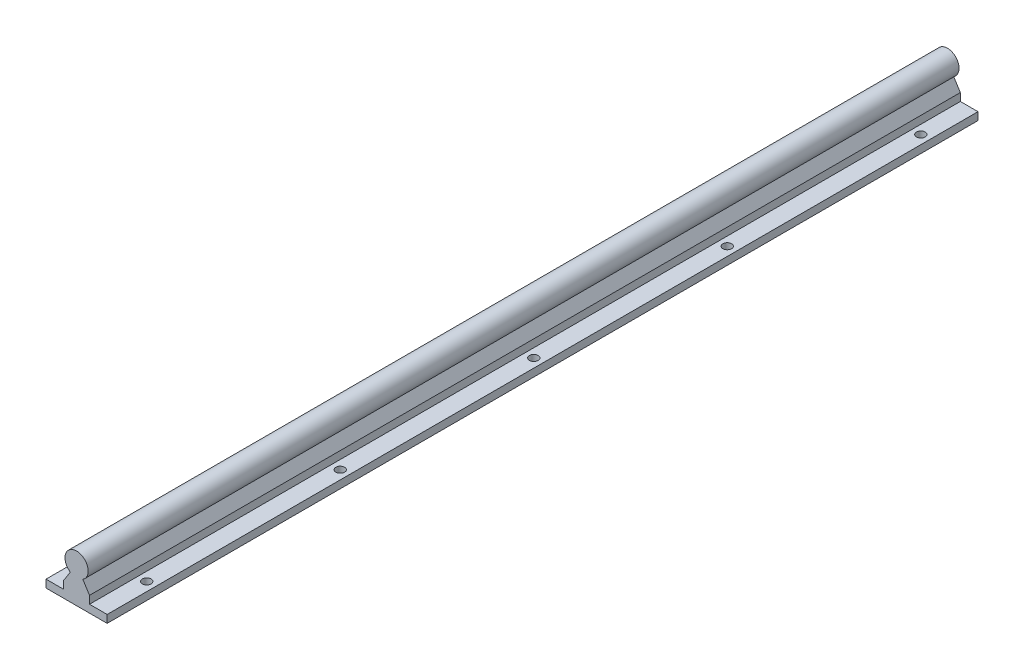
ISO-10303-21;
HEADER;
FILE_DESCRIPTION(('STEP AP214'),'2;1');
FILE_NAME('part.step','',(''),(''),'','','');
FILE_SCHEMA(('AUTOMOTIVE_DESIGN { 1 0 10303 214 1 1 1 1 }'));
ENDSEC;
DATA;
#1=APPLICATION_CONTEXT('core data for automotive mechanical design processes');
#2=APPLICATION_PROTOCOL_DEFINITION('international standard','automotive_design',2000,#1);
#3=PRODUCT_CONTEXT('',#1,'mechanical');
#4=PRODUCT('Part','Part','',(#3));
#5=PRODUCT_RELATED_PRODUCT_CATEGORY('part','',(#4));
#6=PRODUCT_DEFINITION_FORMATION('','',#4);
#7=PRODUCT_DEFINITION_CONTEXT('part definition',#1,'design');
#8=PRODUCT_DEFINITION('design','',#6,#7);
#9=PRODUCT_DEFINITION_SHAPE('','',#8);
#10=(LENGTH_UNIT() NAMED_UNIT(*) SI_UNIT(.MILLI.,.METRE.));
#11=(NAMED_UNIT(*) PLANE_ANGLE_UNIT() SI_UNIT($,.RADIAN.));
#12=(NAMED_UNIT(*) SI_UNIT($,.STERADIAN.) SOLID_ANGLE_UNIT());
#13=UNCERTAINTY_MEASURE_WITH_UNIT(LENGTH_MEASURE(1.E-05),#10,'distance_accuracy_value','');
#14=(GEOMETRIC_REPRESENTATION_CONTEXT(3) GLOBAL_UNCERTAINTY_ASSIGNED_CONTEXT((#13)) GLOBAL_UNIT_ASSIGNED_CONTEXT((#10,
#11,#12)) REPRESENTATION_CONTEXT('',''));
#15=CARTESIAN_POINT('',(0.,0.,0.));
#16=DIRECTION('',(0.,0.,1.));
#17=DIRECTION('',(1.,0.,0.));
#18=AXIS2_PLACEMENT_3D('',#15,#16,#17);
#19=CARTESIAN_POINT('',(-15.8,0.,450.));
#20=DIRECTION('',(1.,0.,0.));
#21=DIRECTION('',(0.,0.,-1.));
#22=AXIS2_PLACEMENT_3D('',#19,#20,#21);
#23=PLANE('',#22);
#24=DIRECTION('',(0.,-1.,0.));
#25=VECTOR('',#24,1.);
#26=CARTESIAN_POINT('',(-15.8,0.,0.));
#27=LINE('',#26,#25);
#28=CARTESIAN_POINT('',(-15.8,4.,0.));
#29=VERTEX_POINT('',#28);
#30=CARTESIAN_POINT('',(-15.8,0.,0.));
#31=VERTEX_POINT('',#30);
#32=EDGE_CURVE('E143',#29,#31,#27,.T.);
#33=ORIENTED_EDGE('',*,*,#32,.T.);
#34=DIRECTION('',(0.,0.,-1.));
#35=VECTOR('',#34,1.);
#36=CARTESIAN_POINT('',(-15.8,0.,450.));
#37=LINE('',#36,#35);
#38=CARTESIAN_POINT('',(-15.8,0.,450.));
#39=VERTEX_POINT('',#38);
#40=EDGE_CURVE('E11',#39,#31,#37,.T.);
#41=ORIENTED_EDGE('',*,*,#40,.F.);
#42=DIRECTION('',(0.,-1.,0.));
#43=VECTOR('',#42,1.);
#44=CARTESIAN_POINT('',(-15.8,0.,450.));
#45=LINE('',#44,#43);
#46=CARTESIAN_POINT('',(-15.8,4.,450.));
#47=VERTEX_POINT('',#46);
#48=EDGE_CURVE('E162',#47,#39,#45,.T.);
#49=ORIENTED_EDGE('',*,*,#48,.F.);
#50=DIRECTION('',(0.,0.,-1.));
#51=VECTOR('',#50,1.);
#52=CARTESIAN_POINT('',(-15.8,4.,450.));
#53=LINE('',#52,#51);
#54=EDGE_CURVE('E139',#47,#29,#53,.T.);
#55=ORIENTED_EDGE('',*,*,#54,.T.);
#56=EDGE_LOOP('',(#33,#41,#49,#55));
#57=FACE_BOUND('',#56,.T.);
#58=ADVANCED_FACE('F33',(#57),#23,.F.);
#59=CARTESIAN_POINT('',(-15.8,0.,450.));
#60=DIRECTION('',(0.,1.,0.));
#61=DIRECTION('',(-1.,0.,0.));
#62=AXIS2_PLACEMENT_3D('',#59,#60,#61);
#63=PLANE('',#62);
#64=CARTESIAN_POINT('',(11.2446188692435,0.,425.));
#65=DIRECTION('',(0.,1.,0.));
#66=DIRECTION('',(0.,0.,-1.));
#67=AXIS2_PLACEMENT_3D('',#64,#65,#66);
#68=CIRCLE('',#67,2.25);
#69=CARTESIAN_POINT('',(11.2446188692435,0.,422.75));
#70=VERTEX_POINT('',#69);
#71=EDGE_CURVE('E222',#70,#70,#68,.T.);
#72=ORIENTED_EDGE('',*,*,#71,.T.);
#73=EDGE_LOOP('',(#72));
#74=FACE_BOUND('',#73,.T.);
#75=CARTESIAN_POINT('',(-11.2446188692351,0.,425.));
#76=DIRECTION('',(0.,1.,0.));
#77=DIRECTION('',(0.,0.,1.));
#78=AXIS2_PLACEMENT_3D('',#75,#76,#77);
#79=CIRCLE('',#78,2.25);
#80=CARTESIAN_POINT('',(-11.2446188692351,0.,427.25));
#81=VERTEX_POINT('',#80);
#82=EDGE_CURVE('E212',#81,#81,#79,.T.);
#83=ORIENTED_EDGE('',*,*,#82,.T.);
#84=EDGE_LOOP('',(#83));
#85=FACE_BOUND('',#84,.T.);
#86=CARTESIAN_POINT('',(11.2446188692424,0.,325.));
#87=DIRECTION('',(0.,1.,0.));
#88=DIRECTION('',(0.,0.,-1.));
#89=AXIS2_PLACEMENT_3D('',#86,#87,#88);
#90=CIRCLE('',#89,2.25);
#91=CARTESIAN_POINT('',(11.2446188692424,0.,322.75));
#92=VERTEX_POINT('',#91);
#93=EDGE_CURVE('E209',#92,#92,#90,.T.);
#94=ORIENTED_EDGE('',*,*,#93,.T.);
#95=EDGE_LOOP('',(#94));
#96=FACE_BOUND('',#95,.T.);
#97=CARTESIAN_POINT('',(-11.2446188692361,0.,325.));
#98=DIRECTION('',(0.,1.,0.));
#99=DIRECTION('',(0.,0.,1.));
#100=AXIS2_PLACEMENT_3D('',#97,#98,#99);
#101=CIRCLE('',#100,2.25);
#102=CARTESIAN_POINT('',(-11.2446188692361,0.,327.25));
#103=VERTEX_POINT('',#102);
#104=EDGE_CURVE('E206',#103,#103,#101,.T.);
#105=ORIENTED_EDGE('',*,*,#104,.T.);
#106=EDGE_LOOP('',(#105));
#107=FACE_BOUND('',#106,.T.);
#108=CARTESIAN_POINT('',(11.2446188692414,0.,225.));
#109=DIRECTION('',(0.,1.,0.));
#110=DIRECTION('',(0.,0.,-1.));
#111=AXIS2_PLACEMENT_3D('',#108,#109,#110);
#112=CIRCLE('',#111,2.25);
#113=CARTESIAN_POINT('',(11.2446188692414,0.,222.75));
#114=VERTEX_POINT('',#113);
#115=EDGE_CURVE('E202',#114,#114,#112,.T.);
#116=ORIENTED_EDGE('',*,*,#115,.T.);
#117=EDGE_LOOP('',(#116));
#118=FACE_BOUND('',#117,.T.);
#119=CARTESIAN_POINT('',(-11.2446188692372,0.,225.));
#120=DIRECTION('',(0.,1.,0.));
#121=DIRECTION('',(0.,0.,1.));
#122=AXIS2_PLACEMENT_3D('',#119,#120,#121);
#123=CIRCLE('',#122,2.25);
#124=CARTESIAN_POINT('',(-11.2446188692372,0.,227.25));
#125=VERTEX_POINT('',#124);
#126=EDGE_CURVE('E198',#125,#125,#123,.T.);
#127=ORIENTED_EDGE('',*,*,#126,.T.);
#128=EDGE_LOOP('',(#127));
#129=FACE_BOUND('',#128,.T.);
#130=CARTESIAN_POINT('',(11.2446188692403,0.,125.));
#131=DIRECTION('',(0.,1.,0.));
#132=DIRECTION('',(0.,0.,-1.));
#133=AXIS2_PLACEMENT_3D('',#130,#131,#132);
#134=CIRCLE('',#133,2.25);
#135=CARTESIAN_POINT('',(11.2446188692403,0.,122.75));
#136=VERTEX_POINT('',#135);
#137=EDGE_CURVE('E194',#136,#136,#134,.T.);
#138=ORIENTED_EDGE('',*,*,#137,.T.);
#139=EDGE_LOOP('',(#138));
#140=FACE_BOUND('',#139,.T.);
#141=CARTESIAN_POINT('',(-11.2446188692382,0.,125.));
#142=DIRECTION('',(0.,1.,0.));
#143=DIRECTION('',(0.,0.,1.));
#144=AXIS2_PLACEMENT_3D('',#141,#142,#143);
#145=CIRCLE('',#144,2.25);
#146=CARTESIAN_POINT('',(-11.2446188692382,0.,127.25));
#147=VERTEX_POINT('',#146);
#148=EDGE_CURVE('E190',#147,#147,#145,.T.);
#149=ORIENTED_EDGE('',*,*,#148,.T.);
#150=EDGE_LOOP('',(#149));
#151=FACE_BOUND('',#150,.T.);
#152=CARTESIAN_POINT('',(11.2446188692393,0.,25.));
#153=DIRECTION('',(0.,1.,0.));
#154=DIRECTION('',(0.,0.,-1.));
#155=AXIS2_PLACEMENT_3D('',#152,#153,#154);
#156=CIRCLE('',#155,2.25);
#157=CARTESIAN_POINT('',(11.2446188692393,0.,22.75));
#158=VERTEX_POINT('',#157);
#159=EDGE_CURVE('E186',#158,#158,#156,.T.);
#160=ORIENTED_EDGE('',*,*,#159,.T.);
#161=EDGE_LOOP('',(#160));
#162=FACE_BOUND('',#161,.T.);
#163=CARTESIAN_POINT('',(-11.2446188692393,0.,25.));
#164=DIRECTION('',(0.,1.,0.));
#165=DIRECTION('',(0.,0.,1.));
#166=AXIS2_PLACEMENT_3D('',#163,#164,#165);
#167=CIRCLE('',#166,2.25);
#168=CARTESIAN_POINT('',(-11.2446188692393,0.,27.25));
#169=VERTEX_POINT('',#168);
#170=EDGE_CURVE('E182',#169,#169,#167,.T.);
#171=ORIENTED_EDGE('',*,*,#170,.T.);
#172=EDGE_LOOP('',(#171));
#173=FACE_BOUND('',#172,.T.);
#174=DIRECTION('',(1.,0.,0.));
#175=VECTOR('',#174,1.);
#176=CARTESIAN_POINT('',(-15.8,0.,0.));
#177=LINE('',#176,#175);
#178=CARTESIAN_POINT('',(15.8,0.,0.));
#179=VERTEX_POINT('',#178);
#180=EDGE_CURVE('E146',#31,#179,#177,.T.);
#181=ORIENTED_EDGE('',*,*,#180,.T.);
#182=DIRECTION('',(0.,0.,-1.));
#183=VECTOR('',#182,1.);
#184=CARTESIAN_POINT('',(15.8,0.,450.));
#185=LINE('',#184,#183);
#186=CARTESIAN_POINT('',(15.8,0.,450.));
#187=VERTEX_POINT('',#186);
#188=EDGE_CURVE('E42',#187,#179,#185,.T.);
#189=ORIENTED_EDGE('',*,*,#188,.F.);
#190=DIRECTION('',(1.,0.,0.));
#191=VECTOR('',#190,1.);
#192=CARTESIAN_POINT('',(-15.8,0.,450.));
#193=LINE('',#192,#191);
#194=EDGE_CURVE('E100',#39,#187,#193,.T.);
#195=ORIENTED_EDGE('',*,*,#194,.F.);
#196=ORIENTED_EDGE('',*,*,#40,.T.);
#197=EDGE_LOOP('',(#181,#189,#195,#196));
#198=FACE_BOUND('',#197,.T.);
#199=ADVANCED_FACE('F278',(#74,#85,#96,#107,#118,#129,#140,#151,#162,#173,#198),#63,.F.);
#200=CARTESIAN_POINT('',(15.8,0.,450.));
#201=DIRECTION('',(-1.,0.,0.));
#202=DIRECTION('',(0.,-1.,0.));
#203=AXIS2_PLACEMENT_3D('',#200,#201,#202);
#204=PLANE('',#203);
#205=DIRECTION('',(0.,1.,0.));
#206=VECTOR('',#205,1.);
#207=CARTESIAN_POINT('',(15.8,0.,0.));
#208=LINE('',#207,#206);
#209=CARTESIAN_POINT('',(15.8,4.,0.));
#210=VERTEX_POINT('',#209);
#211=EDGE_CURVE('E149',#179,#210,#208,.T.);
#212=ORIENTED_EDGE('',*,*,#211,.T.);
#213=DIRECTION('',(0.,0.,-1.));
#214=VECTOR('',#213,1.);
#215=CARTESIAN_POINT('',(15.8,4.,450.));
#216=LINE('',#215,#214);
#217=CARTESIAN_POINT('',(15.8,4.,450.));
#218=VERTEX_POINT('',#217);
#219=EDGE_CURVE('E175',#218,#210,#216,.T.);
#220=ORIENTED_EDGE('',*,*,#219,.F.);
#221=DIRECTION('',(0.,1.,0.));
#222=VECTOR('',#221,1.);
#223=CARTESIAN_POINT('',(15.8,0.,450.));
#224=LINE('',#223,#222);
#225=EDGE_CURVE('E241',#187,#218,#224,.T.);
#226=ORIENTED_EDGE('',*,*,#225,.F.);
#227=ORIENTED_EDGE('',*,*,#188,.T.);
#228=EDGE_LOOP('',(#212,#220,#226,#227));
#229=FACE_BOUND('',#228,.T.);
#230=ADVANCED_FACE('F282',(#229),#204,.F.);
#231=CARTESIAN_POINT('',(15.8,4.,450.));
#232=DIRECTION('',(0.,-1.,0.));
#233=DIRECTION('',(0.,0.,-1.));
#234=AXIS2_PLACEMENT_3D('',#231,#232,#233);
#235=PLANE('',#234);
#236=CARTESIAN_POINT('',(11.2446188692435,4.,425.));
#237=DIRECTION('',(0.,-1.,0.));
#238=DIRECTION('',(0.,0.,-1.));
#239=AXIS2_PLACEMENT_3D('',#236,#237,#238);
#240=CIRCLE('',#239,2.25);
#241=CARTESIAN_POINT('',(11.2446188692435,4.,422.75));
#242=VERTEX_POINT('',#241);
#243=EDGE_CURVE('E36',#242,#242,#240,.F.);
#244=ORIENTED_EDGE('',*,*,#243,.F.);
#245=EDGE_LOOP('',(#244));
#246=FACE_BOUND('',#245,.T.);
#247=CARTESIAN_POINT('',(11.2446188692424,4.,325.));
#248=DIRECTION('',(0.,-1.,0.));
#249=DIRECTION('',(0.,0.,-1.));
#250=AXIS2_PLACEMENT_3D('',#247,#248,#249);
#251=CIRCLE('',#250,2.25);
#252=CARTESIAN_POINT('',(11.2446188692424,4.,322.75));
#253=VERTEX_POINT('',#252);
#254=EDGE_CURVE('E207',#253,#253,#251,.F.);
#255=ORIENTED_EDGE('',*,*,#254,.F.);
#256=EDGE_LOOP('',(#255));
#257=FACE_BOUND('',#256,.T.);
#258=CARTESIAN_POINT('',(11.2446188692414,4.,225.));
#259=DIRECTION('',(0.,-1.,0.));
#260=DIRECTION('',(0.,0.,-1.));
#261=AXIS2_PLACEMENT_3D('',#258,#259,#260);
#262=CIRCLE('',#261,2.25);
#263=CARTESIAN_POINT('',(11.2446188692414,4.,222.75));
#264=VERTEX_POINT('',#263);
#265=EDGE_CURVE('E199',#264,#264,#262,.F.);
#266=ORIENTED_EDGE('',*,*,#265,.F.);
#267=EDGE_LOOP('',(#266));
#268=FACE_BOUND('',#267,.T.);
#269=CARTESIAN_POINT('',(11.2446188692403,4.,125.));
#270=DIRECTION('',(0.,-1.,0.));
#271=DIRECTION('',(0.,0.,-1.));
#272=AXIS2_PLACEMENT_3D('',#269,#270,#271);
#273=CIRCLE('',#272,2.25);
#274=CARTESIAN_POINT('',(11.2446188692403,4.,122.75));
#275=VERTEX_POINT('',#274);
#276=EDGE_CURVE('E191',#275,#275,#273,.F.);
#277=ORIENTED_EDGE('',*,*,#276,.F.);
#278=EDGE_LOOP('',(#277));
#279=FACE_BOUND('',#278,.T.);
#280=CARTESIAN_POINT('',(11.2446188692393,4.,25.));
#281=DIRECTION('',(0.,-1.,0.));
#282=DIRECTION('',(0.,0.,-1.));
#283=AXIS2_PLACEMENT_3D('',#280,#281,#282);
#284=CIRCLE('',#283,2.25);
#285=CARTESIAN_POINT('',(11.2446188692393,4.,22.75));
#286=VERTEX_POINT('',#285);
#287=EDGE_CURVE('E183',#286,#286,#284,.F.);
#288=ORIENTED_EDGE('',*,*,#287,.F.);
#289=EDGE_LOOP('',(#288));
#290=FACE_BOUND('',#289,.T.);
#291=DIRECTION('',(-1.,0.,0.));
#292=VECTOR('',#291,1.);
#293=CARTESIAN_POINT('',(15.8,4.,0.));
#294=LINE('',#293,#292);
#295=CARTESIAN_POINT('',(6.68923773847858,4.,0.));
#296=VERTEX_POINT('',#295);
#297=EDGE_CURVE('E151',#210,#296,#294,.T.);
#298=ORIENTED_EDGE('',*,*,#297,.T.);
#299=DIRECTION('',(0.,0.,-1.));
#300=VECTOR('',#299,1.);
#301=CARTESIAN_POINT('',(6.68923773847858,4.,450.));
#302=LINE('',#301,#300);
#303=CARTESIAN_POINT('',(6.68923773847858,4.,450.));
#304=VERTEX_POINT('',#303);
#305=EDGE_CURVE('E172',#304,#296,#302,.T.);
#306=ORIENTED_EDGE('',*,*,#305,.F.);
#307=DIRECTION('',(-1.,0.,0.));
#308=VECTOR('',#307,1.);
#309=CARTESIAN_POINT('',(15.8,4.,450.));
#310=LINE('',#309,#308);
#311=EDGE_CURVE('E243',#218,#304,#310,.T.);
#312=ORIENTED_EDGE('',*,*,#311,.F.);
#313=ORIENTED_EDGE('',*,*,#219,.T.);
#314=EDGE_LOOP('',(#298,#306,#312,#313));
#315=FACE_BOUND('',#314,.T.);
#316=ADVANCED_FACE('F287',(#246,#257,#268,#279,#290,#315),#235,.F.);
#317=CARTESIAN_POINT('',(6.68923773847858,4.,450.));
#318=DIRECTION('',(-1.,0.,0.));
#319=DIRECTION('',(0.,-1.,0.));
#320=AXIS2_PLACEMENT_3D('',#317,#318,#319);
#321=PLANE('',#320);
#322=DIRECTION('',(0.,1.,0.));
#323=VECTOR('',#322,1.);
#324=CARTESIAN_POINT('',(6.68923773847858,4.,0.));
#325=LINE('',#324,#323);
#326=CARTESIAN_POINT('',(6.68923773847859,8.,0.));
#327=VERTEX_POINT('',#326);
#328=EDGE_CURVE('E153',#296,#327,#325,.T.);
#329=ORIENTED_EDGE('',*,*,#328,.T.);
#330=DIRECTION('',(0.,0.,-1.));
#331=VECTOR('',#330,1.);
#332=CARTESIAN_POINT('',(6.68923773847859,8.,450.));
#333=LINE('',#332,#331);
#334=CARTESIAN_POINT('',(6.68923773847859,8.,450.));
#335=VERTEX_POINT('',#334);
#336=EDGE_CURVE('E169',#335,#327,#333,.T.);
#337=ORIENTED_EDGE('',*,*,#336,.F.);
#338=DIRECTION('',(0.,1.,0.));
#339=VECTOR('',#338,1.);
#340=CARTESIAN_POINT('',(6.68923773847858,4.,450.));
#341=LINE('',#340,#339);
#342=EDGE_CURVE('E245',#304,#335,#341,.T.);
#343=ORIENTED_EDGE('',*,*,#342,.F.);
#344=ORIENTED_EDGE('',*,*,#305,.T.);
#345=EDGE_LOOP('',(#329,#337,#343,#344));
#346=FACE_BOUND('',#345,.T.);
#347=ADVANCED_FACE('F294',(#346),#321,.F.);
#348=CARTESIAN_POINT('',(6.68923773847859,8.,450.));
#349=DIRECTION('',(-0.843391445812889,-0.537299608346819,0.));
#350=DIRECTION('',(0.537299608346819,-0.843391445812889,0.));
#351=AXIS2_PLACEMENT_3D('',#348,#349,#350);
#352=PLANE('',#351);
#353=DIRECTION('',(-0.537299608346819,0.843391445812889,0.));
#354=VECTOR('',#353,1.);
#355=CARTESIAN_POINT('',(6.68923773847859,8.,0.));
#356=LINE('',#355,#354);
#357=CARTESIAN_POINT('',(3.22379765008091,13.4396513251227,0.));
#358=VERTEX_POINT('',#357);
#359=EDGE_CURVE('E155',#327,#358,#356,.T.);
#360=ORIENTED_EDGE('',*,*,#359,.T.);
#361=DIRECTION('',(0.,0.,-1.));
#362=VECTOR('',#361,1.);
#363=CARTESIAN_POINT('',(3.22379765008091,13.4396513251227,450.));
#364=LINE('',#363,#362);
#365=CARTESIAN_POINT('',(3.22379765008091,13.4396513251227,450.));
#366=VERTEX_POINT('',#365);
#367=EDGE_CURVE('E166',#366,#358,#364,.T.);
#368=ORIENTED_EDGE('',*,*,#367,.F.);
#369=DIRECTION('',(-0.537299608346819,0.843391445812889,0.));
#370=VECTOR('',#369,1.);
#371=CARTESIAN_POINT('',(6.68923773847859,8.,450.));
#372=LINE('',#371,#370);
#373=EDGE_CURVE('E247',#335,#366,#372,.T.);
#374=ORIENTED_EDGE('',*,*,#373,.F.);
#375=ORIENTED_EDGE('',*,*,#336,.T.);
#376=EDGE_LOOP('',(#360,#368,#374,#375));
#377=FACE_BOUND('',#376,.T.);
#378=ADVANCED_FACE('F253',(#377),#352,.F.);
#379=CARTESIAN_POINT('',(0.,18.5,450.));
#380=DIRECTION('',(0.,0.,-1.));
#381=DIRECTION('',(-1.,0.,0.));
#382=AXIS2_PLACEMENT_3D('',#379,#380,#381);
#383=CYLINDRICAL_SURFACE('',#382,6.);
#384=CARTESIAN_POINT('',(0.,18.5,0.));
#385=DIRECTION('',(0.,0.,1.));
#386=DIRECTION('',(1.,0.,0.));
#387=AXIS2_PLACEMENT_3D('',#384,#385,#386);
#388=CIRCLE('',#387,6.);
#389=CARTESIAN_POINT('',(-3.22379765008091,13.4396513251227,0.));
#390=VERTEX_POINT('',#389);
#391=EDGE_CURVE('E157',#358,#390,#388,.T.);
#392=ORIENTED_EDGE('',*,*,#391,.T.);
#393=DIRECTION('',(0.,0.,-1.));
#394=VECTOR('',#393,1.);
#395=CARTESIAN_POINT('',(-3.22379765008091,13.4396513251227,450.));
#396=LINE('',#395,#394);
#397=CARTESIAN_POINT('',(-3.22379765008091,13.4396513251227,450.));
#398=VERTEX_POINT('',#397);
#399=EDGE_CURVE('E134',#398,#390,#396,.T.);
#400=ORIENTED_EDGE('',*,*,#399,.F.);
#401=CARTESIAN_POINT('',(0.,18.5,450.));
#402=DIRECTION('',(0.,0.,1.));
#403=DIRECTION('',(1.,0.,0.));
#404=AXIS2_PLACEMENT_3D('',#401,#402,#403);
#405=CIRCLE('',#404,6.);
#406=EDGE_CURVE('E125',#366,#398,#405,.T.);
#407=ORIENTED_EDGE('',*,*,#406,.F.);
#408=ORIENTED_EDGE('',*,*,#367,.T.);
#409=EDGE_LOOP('',(#392,#400,#407,#408));
#410=FACE_BOUND('',#409,.T.);
#411=ADVANCED_FACE('F257',(#410),#383,.T.);
#412=CARTESIAN_POINT('',(-6.68923773847859,8.,450.));
#413=DIRECTION('',(0.843391445812889,-0.537299608346819,0.));
#414=DIRECTION('',(0.537299608346819,0.843391445812889,0.));
#415=AXIS2_PLACEMENT_3D('',#412,#413,#414);
#416=PLANE('',#415);
#417=DIRECTION('',(-0.537299608346819,-0.843391445812889,0.));
#418=VECTOR('',#417,1.);
#419=CARTESIAN_POINT('',(-6.68923773847859,8.,0.));
#420=LINE('',#419,#418);
#421=CARTESIAN_POINT('',(-6.68923773847859,8.,0.));
#422=VERTEX_POINT('',#421);
#423=EDGE_CURVE('E133',#390,#422,#420,.T.);
#424=ORIENTED_EDGE('',*,*,#423,.T.);
#425=DIRECTION('',(0.,0.,-1.));
#426=VECTOR('',#425,1.);
#427=CARTESIAN_POINT('',(-6.68923773847859,8.,450.));
#428=LINE('',#427,#426);
#429=CARTESIAN_POINT('',(-6.68923773847859,8.,450.));
#430=VERTEX_POINT('',#429);
#431=EDGE_CURVE('E130',#430,#422,#428,.T.);
#432=ORIENTED_EDGE('',*,*,#431,.F.);
#433=DIRECTION('',(-0.537299608346819,-0.843391445812889,0.));
#434=VECTOR('',#433,1.);
#435=CARTESIAN_POINT('',(-6.68923773847859,8.,450.));
#436=LINE('',#435,#434);
#437=EDGE_CURVE('E119',#398,#430,#436,.T.);
#438=ORIENTED_EDGE('',*,*,#437,.F.);
#439=ORIENTED_EDGE('',*,*,#399,.T.);
#440=EDGE_LOOP('',(#424,#432,#438,#439));
#441=FACE_BOUND('',#440,.T.);
#442=ADVANCED_FACE('F131',(#441),#416,.F.);
#443=CARTESIAN_POINT('',(-6.68923773847858,4.,450.));
#444=DIRECTION('',(1.,0.,0.));
#445=DIRECTION('',(0.,1.,0.));
#446=AXIS2_PLACEMENT_3D('',#443,#444,#445);
#447=PLANE('',#446);
#448=DIRECTION('',(0.,-1.,0.));
#449=VECTOR('',#448,1.);
#450=CARTESIAN_POINT('',(-6.68923773847858,4.,0.));
#451=LINE('',#450,#449);
#452=CARTESIAN_POINT('',(-6.68923773847858,4.,0.));
#453=VERTEX_POINT('',#452);
#454=EDGE_CURVE('E86',#422,#453,#451,.T.);
#455=ORIENTED_EDGE('',*,*,#454,.T.);
#456=DIRECTION('',(0.,0.,-1.));
#457=VECTOR('',#456,1.);
#458=CARTESIAN_POINT('',(-6.68923773847858,4.,450.));
#459=LINE('',#458,#457);
#460=CARTESIAN_POINT('',(-6.68923773847858,4.,450.));
#461=VERTEX_POINT('',#460);
#462=EDGE_CURVE('E135',#461,#453,#459,.T.);
#463=ORIENTED_EDGE('',*,*,#462,.F.);
#464=DIRECTION('',(0.,-1.,0.));
#465=VECTOR('',#464,1.);
#466=CARTESIAN_POINT('',(-6.68923773847858,4.,450.));
#467=LINE('',#466,#465);
#468=EDGE_CURVE('E123',#430,#461,#467,.T.);
#469=ORIENTED_EDGE('',*,*,#468,.F.);
#470=ORIENTED_EDGE('',*,*,#431,.T.);
#471=EDGE_LOOP('',(#455,#463,#469,#470));
#472=FACE_BOUND('',#471,.T.);
#473=ADVANCED_FACE('F137',(#472),#447,.F.);
#474=CARTESIAN_POINT('',(-15.8,4.,450.));
#475=DIRECTION('',(0.,-1.,0.));
#476=DIRECTION('',(0.,0.,-1.));
#477=AXIS2_PLACEMENT_3D('',#474,#475,#476);
#478=PLANE('',#477);
#479=CARTESIAN_POINT('',(-11.2446188692351,4.,425.));
#480=DIRECTION('',(0.,-1.,0.));
#481=DIRECTION('',(0.,0.,-1.));
#482=AXIS2_PLACEMENT_3D('',#479,#480,#481);
#483=CIRCLE('',#482,2.25);
#484=CARTESIAN_POINT('',(-11.2446188692351,4.,422.75));
#485=VERTEX_POINT('',#484);
#486=EDGE_CURVE('E210',#485,#485,#483,.F.);
#487=ORIENTED_EDGE('',*,*,#486,.F.);
#488=EDGE_LOOP('',(#487));
#489=FACE_BOUND('',#488,.T.);
#490=CARTESIAN_POINT('',(-11.2446188692361,4.,325.));
#491=DIRECTION('',(0.,-1.,0.));
#492=DIRECTION('',(0.,0.,-1.));
#493=AXIS2_PLACEMENT_3D('',#490,#491,#492);
#494=CIRCLE('',#493,2.25);
#495=CARTESIAN_POINT('',(-11.2446188692361,4.,322.75));
#496=VERTEX_POINT('',#495);
#497=EDGE_CURVE('E203',#496,#496,#494,.F.);
#498=ORIENTED_EDGE('',*,*,#497,.F.);
#499=EDGE_LOOP('',(#498));
#500=FACE_BOUND('',#499,.T.);
#501=CARTESIAN_POINT('',(-11.2446188692372,4.,225.));
#502=DIRECTION('',(0.,-1.,0.));
#503=DIRECTION('',(0.,0.,-1.));
#504=AXIS2_PLACEMENT_3D('',#501,#502,#503);
#505=CIRCLE('',#504,2.25);
#506=CARTESIAN_POINT('',(-11.2446188692372,4.,222.75));
#507=VERTEX_POINT('',#506);
#508=EDGE_CURVE('E195',#507,#507,#505,.F.);
#509=ORIENTED_EDGE('',*,*,#508,.F.);
#510=EDGE_LOOP('',(#509));
#511=FACE_BOUND('',#510,.T.);
#512=CARTESIAN_POINT('',(-11.2446188692382,4.,125.));
#513=DIRECTION('',(0.,-1.,0.));
#514=DIRECTION('',(0.,0.,-1.));
#515=AXIS2_PLACEMENT_3D('',#512,#513,#514);
#516=CIRCLE('',#515,2.25);
#517=CARTESIAN_POINT('',(-11.2446188692382,4.,122.75));
#518=VERTEX_POINT('',#517);
#519=EDGE_CURVE('E187',#518,#518,#516,.F.);
#520=ORIENTED_EDGE('',*,*,#519,.F.);
#521=EDGE_LOOP('',(#520));
#522=FACE_BOUND('',#521,.T.);
#523=CARTESIAN_POINT('',(-11.2446188692393,4.,25.));
#524=DIRECTION('',(0.,-1.,0.));
#525=DIRECTION('',(0.,0.,-1.));
#526=AXIS2_PLACEMENT_3D('',#523,#524,#525);
#527=CIRCLE('',#526,2.25);
#528=CARTESIAN_POINT('',(-11.2446188692393,4.,22.75));
#529=VERTEX_POINT('',#528);
#530=EDGE_CURVE('E147',#529,#529,#527,.F.);
#531=ORIENTED_EDGE('',*,*,#530,.F.);
#532=EDGE_LOOP('',(#531));
#533=FACE_BOUND('',#532,.T.);
#534=DIRECTION('',(-1.,0.,0.));
#535=VECTOR('',#534,1.);
#536=CARTESIAN_POINT('',(-15.8,4.,0.));
#537=LINE('',#536,#535);
#538=EDGE_CURVE('E92',#453,#29,#537,.T.);
#539=ORIENTED_EDGE('',*,*,#538,.T.);
#540=ORIENTED_EDGE('',*,*,#54,.F.);
#541=DIRECTION('',(-1.,0.,0.));
#542=VECTOR('',#541,1.);
#543=CARTESIAN_POINT('',(-15.8,4.,450.));
#544=LINE('',#543,#542);
#545=EDGE_CURVE('E51',#461,#47,#544,.T.);
#546=ORIENTED_EDGE('',*,*,#545,.F.);
#547=ORIENTED_EDGE('',*,*,#462,.T.);
#548=EDGE_LOOP('',(#539,#540,#546,#547));
#549=FACE_BOUND('',#548,.T.);
#550=ADVANCED_FACE('F265',(#489,#500,#511,#522,#533,#549),#478,.F.);
#551=CARTESIAN_POINT('',(0.,18.5,450.));
#552=DIRECTION('',(0.,0.,1.));
#553=DIRECTION('',(1.,0.,0.));
#554=AXIS2_PLACEMENT_3D('',#551,#552,#553);
#555=PLANE('',#554);
#556=ORIENTED_EDGE('',*,*,#48,.T.);
#557=ORIENTED_EDGE('',*,*,#194,.T.);
#558=ORIENTED_EDGE('',*,*,#225,.T.);
#559=ORIENTED_EDGE('',*,*,#311,.T.);
#560=ORIENTED_EDGE('',*,*,#342,.T.);
#561=ORIENTED_EDGE('',*,*,#373,.T.);
#562=ORIENTED_EDGE('',*,*,#406,.T.);
#563=ORIENTED_EDGE('',*,*,#437,.T.);
#564=ORIENTED_EDGE('',*,*,#468,.T.);
#565=ORIENTED_EDGE('',*,*,#545,.T.);
#566=EDGE_LOOP('',(#556,#557,#558,#559,#560,#561,#562,#563,#564,#565));
#567=FACE_BOUND('',#566,.T.);
#568=ADVANCED_FACE('F121',(#567),#555,.T.);
#569=CARTESIAN_POINT('',(0.,18.5,0.));
#570=DIRECTION('',(0.,0.,1.));
#571=DIRECTION('',(1.,0.,0.));
#572=AXIS2_PLACEMENT_3D('',#569,#570,#571);
#573=PLANE('',#572);
#574=ORIENTED_EDGE('',*,*,#32,.F.);
#575=ORIENTED_EDGE('',*,*,#538,.F.);
#576=ORIENTED_EDGE('',*,*,#454,.F.);
#577=ORIENTED_EDGE('',*,*,#423,.F.);
#578=ORIENTED_EDGE('',*,*,#391,.F.);
#579=ORIENTED_EDGE('',*,*,#359,.F.);
#580=ORIENTED_EDGE('',*,*,#328,.F.);
#581=ORIENTED_EDGE('',*,*,#297,.F.);
#582=ORIENTED_EDGE('',*,*,#211,.F.);
#583=ORIENTED_EDGE('',*,*,#180,.F.);
#584=EDGE_LOOP('',(#574,#575,#576,#577,#578,#579,#580,#581,#582,#583));
#585=FACE_BOUND('',#584,.T.);
#586=ADVANCED_FACE('F260',(#585),#573,.F.);
#587=CARTESIAN_POINT('',(-11.2446188692393,24.5,25.));
#588=DIRECTION('',(0.,-1.,0.));
#589=DIRECTION('',(0.,0.,-1.));
#590=AXIS2_PLACEMENT_3D('',#587,#588,#589);
#591=CYLINDRICAL_SURFACE('',#590,2.25);
#592=ORIENTED_EDGE('',*,*,#170,.F.);
#593=EDGE_LOOP('',(#592));
#594=FACE_BOUND('',#593,.T.);
#595=ORIENTED_EDGE('',*,*,#530,.T.);
#596=EDGE_LOOP('',(#595));
#597=FACE_BOUND('',#596,.T.);
#598=ADVANCED_FACE('F327',(#594,#597),#591,.F.);
#599=CARTESIAN_POINT('',(11.2446188692393,24.5,25.));
#600=DIRECTION('',(0.,-1.,0.));
#601=DIRECTION('',(0.,0.,-1.));
#602=AXIS2_PLACEMENT_3D('',#599,#600,#601);
#603=CYLINDRICAL_SURFACE('',#602,2.25);
#604=ORIENTED_EDGE('',*,*,#159,.F.);
#605=EDGE_LOOP('',(#604));
#606=FACE_BOUND('',#605,.T.);
#607=ORIENTED_EDGE('',*,*,#287,.T.);
#608=EDGE_LOOP('',(#607));
#609=FACE_BOUND('',#608,.T.);
#610=ADVANCED_FACE('F352',(#606,#609),#603,.F.);
#611=CARTESIAN_POINT('',(-11.2446188692382,24.5,125.));
#612=DIRECTION('',(0.,-1.,0.));
#613=DIRECTION('',(0.,0.,-1.));
#614=AXIS2_PLACEMENT_3D('',#611,#612,#613);
#615=CYLINDRICAL_SURFACE('',#614,2.25);
#616=ORIENTED_EDGE('',*,*,#148,.F.);
#617=EDGE_LOOP('',(#616));
#618=FACE_BOUND('',#617,.T.);
#619=ORIENTED_EDGE('',*,*,#519,.T.);
#620=EDGE_LOOP('',(#619));
#621=FACE_BOUND('',#620,.T.);
#622=ADVANCED_FACE('F362',(#618,#621),#615,.F.);
#623=CARTESIAN_POINT('',(11.2446188692403,24.5,125.));
#624=DIRECTION('',(0.,-1.,0.));
#625=DIRECTION('',(0.,0.,-1.));
#626=AXIS2_PLACEMENT_3D('',#623,#624,#625);
#627=CYLINDRICAL_SURFACE('',#626,2.25);
#628=ORIENTED_EDGE('',*,*,#137,.F.);
#629=EDGE_LOOP('',(#628));
#630=FACE_BOUND('',#629,.T.);
#631=ORIENTED_EDGE('',*,*,#276,.T.);
#632=EDGE_LOOP('',(#631));
#633=FACE_BOUND('',#632,.T.);
#634=ADVANCED_FACE('F372',(#630,#633),#627,.F.);
#635=CARTESIAN_POINT('',(-11.2446188692372,24.5,225.));
#636=DIRECTION('',(0.,-1.,0.));
#637=DIRECTION('',(0.,0.,-1.));
#638=AXIS2_PLACEMENT_3D('',#635,#636,#637);
#639=CYLINDRICAL_SURFACE('',#638,2.25);
#640=ORIENTED_EDGE('',*,*,#126,.F.);
#641=EDGE_LOOP('',(#640));
#642=FACE_BOUND('',#641,.T.);
#643=ORIENTED_EDGE('',*,*,#508,.T.);
#644=EDGE_LOOP('',(#643));
#645=FACE_BOUND('',#644,.T.);
#646=ADVANCED_FACE('F382',(#642,#645),#639,.F.);
#647=CARTESIAN_POINT('',(11.2446188692414,24.5,225.));
#648=DIRECTION('',(0.,-1.,0.));
#649=DIRECTION('',(0.,0.,-1.));
#650=AXIS2_PLACEMENT_3D('',#647,#648,#649);
#651=CYLINDRICAL_SURFACE('',#650,2.25);
#652=ORIENTED_EDGE('',*,*,#115,.F.);
#653=EDGE_LOOP('',(#652));
#654=FACE_BOUND('',#653,.T.);
#655=ORIENTED_EDGE('',*,*,#265,.T.);
#656=EDGE_LOOP('',(#655));
#657=FACE_BOUND('',#656,.T.);
#658=ADVANCED_FACE('F392',(#654,#657),#651,.F.);
#659=CARTESIAN_POINT('',(-11.2446188692361,24.5,325.));
#660=DIRECTION('',(0.,-1.,0.));
#661=DIRECTION('',(0.,0.,-1.));
#662=AXIS2_PLACEMENT_3D('',#659,#660,#661);
#663=CYLINDRICAL_SURFACE('',#662,2.25);
#664=ORIENTED_EDGE('',*,*,#104,.F.);
#665=EDGE_LOOP('',(#664));
#666=FACE_BOUND('',#665,.T.);
#667=ORIENTED_EDGE('',*,*,#497,.T.);
#668=EDGE_LOOP('',(#667));
#669=FACE_BOUND('',#668,.T.);
#670=ADVANCED_FACE('F402',(#666,#669),#663,.F.);
#671=CARTESIAN_POINT('',(11.2446188692424,24.5,325.));
#672=DIRECTION('',(0.,-1.,0.));
#673=DIRECTION('',(0.,0.,-1.));
#674=AXIS2_PLACEMENT_3D('',#671,#672,#673);
#675=CYLINDRICAL_SURFACE('',#674,2.25);
#676=ORIENTED_EDGE('',*,*,#93,.F.);
#677=EDGE_LOOP('',(#676));
#678=FACE_BOUND('',#677,.T.);
#679=ORIENTED_EDGE('',*,*,#254,.T.);
#680=EDGE_LOOP('',(#679));
#681=FACE_BOUND('',#680,.T.);
#682=ADVANCED_FACE('F412',(#678,#681),#675,.F.);
#683=CARTESIAN_POINT('',(-11.2446188692351,24.5,425.));
#684=DIRECTION('',(0.,-1.,0.));
#685=DIRECTION('',(0.,0.,-1.));
#686=AXIS2_PLACEMENT_3D('',#683,#684,#685);
#687=CYLINDRICAL_SURFACE('',#686,2.25);
#688=ORIENTED_EDGE('',*,*,#82,.F.);
#689=EDGE_LOOP('',(#688));
#690=FACE_BOUND('',#689,.T.);
#691=ORIENTED_EDGE('',*,*,#486,.T.);
#692=EDGE_LOOP('',(#691));
#693=FACE_BOUND('',#692,.T.);
#694=ADVANCED_FACE('F422',(#690,#693),#687,.F.);
#695=CARTESIAN_POINT('',(11.2446188692435,24.5,425.));
#696=DIRECTION('',(0.,-1.,0.));
#697=DIRECTION('',(0.,0.,-1.));
#698=AXIS2_PLACEMENT_3D('',#695,#696,#697);
#699=CYLINDRICAL_SURFACE('',#698,2.25);
#700=ORIENTED_EDGE('',*,*,#71,.F.);
#701=EDGE_LOOP('',(#700));
#702=FACE_BOUND('',#701,.T.);
#703=ORIENTED_EDGE('',*,*,#243,.T.);
#704=EDGE_LOOP('',(#703));
#705=FACE_BOUND('',#704,.T.);
#706=ADVANCED_FACE('F432',(#702,#705),#699,.F.);
#707=CLOSED_SHELL('',(#58,#199,#230,#316,#347,#378,#411,#442,#473,#550,#568,#586,#598,#610,#622,
#634,#646,#658,#670,#682,#694,#706));
#708=MANIFOLD_SOLID_BREP('B2',#707);
#709=ADVANCED_BREP_SHAPE_REPRESENTATION('',(#18,#708),#14);
#710=SHAPE_DEFINITION_REPRESENTATION(#9,#709);
ENDSEC;
END-ISO-10303-21;
